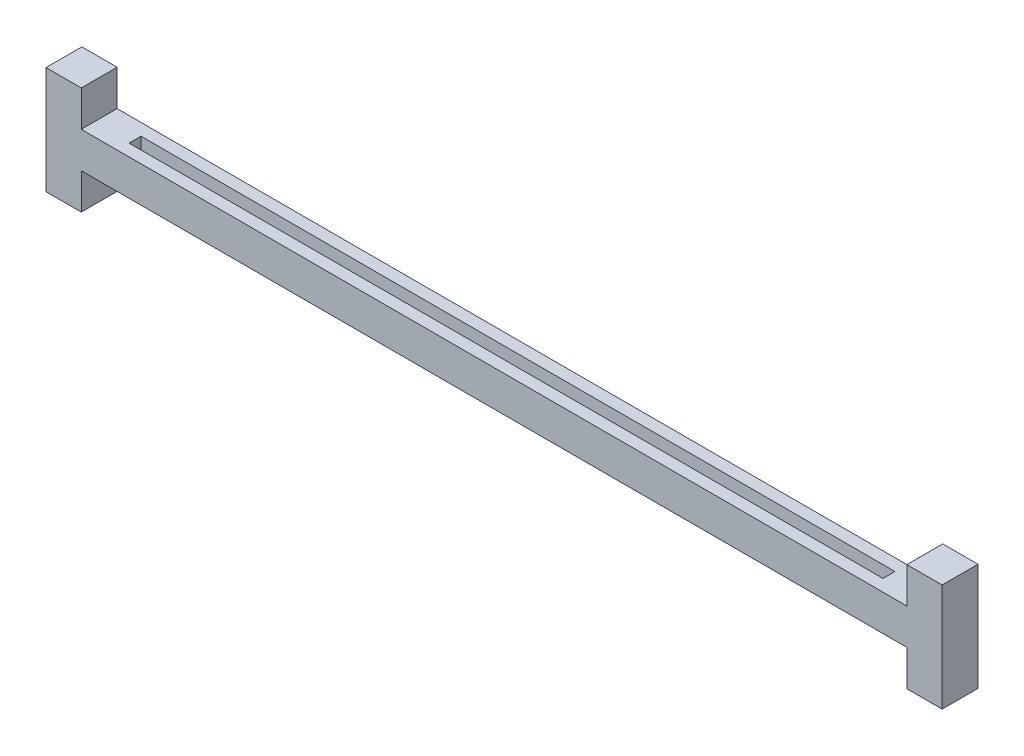
ISO-10303-21;
HEADER;
FILE_DESCRIPTION(('STEP AP214'),'2;1');
FILE_NAME('part.step','',(''),(''),'','','');
FILE_SCHEMA(('AUTOMOTIVE_DESIGN { 1 0 10303 214 1 1 1 1 }'));
ENDSEC;
DATA;
#1=APPLICATION_CONTEXT('core data for automotive mechanical design processes');
#2=APPLICATION_PROTOCOL_DEFINITION('international standard','automotive_design',2000,#1);
#3=PRODUCT_CONTEXT('',#1,'mechanical');
#4=PRODUCT('Part','Part','',(#3));
#5=PRODUCT_RELATED_PRODUCT_CATEGORY('part','',(#4));
#6=PRODUCT_DEFINITION_FORMATION('','',#4);
#7=PRODUCT_DEFINITION_CONTEXT('part definition',#1,'design');
#8=PRODUCT_DEFINITION('design','',#6,#7);
#9=PRODUCT_DEFINITION_SHAPE('','',#8);
#10=(LENGTH_UNIT() NAMED_UNIT(*) SI_UNIT(.MILLI.,.METRE.));
#11=(NAMED_UNIT(*) PLANE_ANGLE_UNIT() SI_UNIT($,.RADIAN.));
#12=(NAMED_UNIT(*) SI_UNIT($,.STERADIAN.) SOLID_ANGLE_UNIT());
#13=UNCERTAINTY_MEASURE_WITH_UNIT(LENGTH_MEASURE(1.E-05),#10,'distance_accuracy_value','');
#14=(GEOMETRIC_REPRESENTATION_CONTEXT(3) GLOBAL_UNCERTAINTY_ASSIGNED_CONTEXT((#13)) GLOBAL_UNIT_ASSIGNED_CONTEXT((#10,
#11,#12)) REPRESENTATION_CONTEXT('',''));
#15=CARTESIAN_POINT('',(0.,0.,0.));
#16=DIRECTION('',(0.,0.,1.));
#17=DIRECTION('',(1.,0.,0.));
#18=AXIS2_PLACEMENT_3D('',#15,#16,#17);
#19=CARTESIAN_POINT('',(-57.58,-2.5,5.));
#20=DIRECTION('',(0.,1.,0.));
#21=DIRECTION('',(0.,0.,1.));
#22=AXIS2_PLACEMENT_3D('',#19,#20,#21);
#23=PLANE('',#22);
#24=DIRECTION('',(1.,0.,0.));
#25=VECTOR('',#24,1.);
#26=CARTESIAN_POINT('',(-57.58,-2.5,0.));
#27=LINE('',#26,#25);
#28=CARTESIAN_POINT('',(-57.58,-2.5,0.));
#29=VERTEX_POINT('',#28);
#30=CARTESIAN_POINT('',(57.58,-2.5,0.));
#31=VERTEX_POINT('',#30);
#32=EDGE_CURVE('E214',#29,#31,#27,.T.);
#33=ORIENTED_EDGE('',*,*,#32,.T.);
#34=DIRECTION('',(0.,0.,-1.));
#35=VECTOR('',#34,1.);
#36=CARTESIAN_POINT('',(57.58,-2.5,5.));
#37=LINE('',#36,#35);
#38=CARTESIAN_POINT('',(57.58,-2.5,5.));
#39=VERTEX_POINT('',#38);
#40=EDGE_CURVE('E254',#39,#31,#37,.T.);
#41=ORIENTED_EDGE('',*,*,#40,.F.);
#42=DIRECTION('',(1.,0.,0.));
#43=VECTOR('',#42,1.);
#44=CARTESIAN_POINT('',(-57.58,-2.5,5.));
#45=LINE('',#44,#43);
#46=CARTESIAN_POINT('',(-57.58,-2.5,5.));
#47=VERTEX_POINT('',#46);
#48=EDGE_CURVE('E189',#47,#39,#45,.T.);
#49=ORIENTED_EDGE('',*,*,#48,.F.);
#50=DIRECTION('',(0.,0.,-1.));
#51=VECTOR('',#50,1.);
#52=CARTESIAN_POINT('',(-57.58,-2.5,5.));
#53=LINE('',#52,#51);
#54=EDGE_CURVE('E257',#47,#29,#53,.T.);
#55=ORIENTED_EDGE('',*,*,#54,.T.);
#56=EDGE_LOOP('',(#33,#41,#49,#55));
#57=FACE_BOUND('',#56,.T.);
#58=DIRECTION('',(1.,0.,0.));
#59=VECTOR('',#58,1.);
#60=CARTESIAN_POINT('',(0.,-2.5,3.33333333333333));
#61=LINE('',#60,#59);
#62=CARTESIAN_POINT('',(-52.58,-2.5,3.33333333333333));
#63=VERTEX_POINT('',#62);
#64=CARTESIAN_POINT('',(52.58,-2.5,3.33333333333333));
#65=VERTEX_POINT('',#64);
#66=EDGE_CURVE('E57',#63,#65,#61,.T.);
#67=ORIENTED_EDGE('',*,*,#66,.T.);
#68=DIRECTION('',(0.,0.,-1.));
#69=VECTOR('',#68,1.);
#70=CARTESIAN_POINT('',(52.58,-2.5,0.));
#71=LINE('',#70,#69);
#72=CARTESIAN_POINT('',(52.58,-2.5,1.66666666666667));
#73=VERTEX_POINT('',#72);
#74=EDGE_CURVE('E171',#65,#73,#71,.T.);
#75=ORIENTED_EDGE('',*,*,#74,.T.);
#76=DIRECTION('',(1.,0.,0.));
#77=VECTOR('',#76,1.);
#78=CARTESIAN_POINT('',(0.,-2.5,1.66666666666667));
#79=LINE('',#78,#77);
#80=CARTESIAN_POINT('',(-52.58,-2.5,1.66666666666667));
#81=VERTEX_POINT('',#80);
#82=EDGE_CURVE('E157',#81,#73,#79,.T.);
#83=ORIENTED_EDGE('',*,*,#82,.F.);
#84=DIRECTION('',(0.,0.,-1.));
#85=VECTOR('',#84,1.);
#86=CARTESIAN_POINT('',(-52.58,-2.5,0.));
#87=LINE('',#86,#85);
#88=EDGE_CURVE('E166',#63,#81,#87,.T.);
#89=ORIENTED_EDGE('',*,*,#88,.F.);
#90=EDGE_LOOP('',(#67,#75,#83,#89));
#91=FACE_BOUND('',#90,.T.);
#92=ADVANCED_FACE('F42',(#57,#91),#23,.F.);
#93=CARTESIAN_POINT('',(-57.58,2.5,5.));
#94=DIRECTION('',(0.,-1.,0.));
#95=DIRECTION('',(0.,0.,-1.));
#96=AXIS2_PLACEMENT_3D('',#93,#94,#95);
#97=PLANE('',#96);
#98=DIRECTION('',(-1.,0.,0.));
#99=VECTOR('',#98,1.);
#100=CARTESIAN_POINT('',(-57.58,2.5,0.));
#101=LINE('',#100,#99);
#102=CARTESIAN_POINT('',(57.58,2.5,0.));
#103=VERTEX_POINT('',#102);
#104=CARTESIAN_POINT('',(-57.58,2.5,0.));
#105=VERTEX_POINT('',#104);
#106=EDGE_CURVE('E226',#103,#105,#101,.T.);
#107=ORIENTED_EDGE('',*,*,#106,.T.);
#108=DIRECTION('',(0.,0.,-1.));
#109=VECTOR('',#108,1.);
#110=CARTESIAN_POINT('',(-57.58,2.5,5.));
#111=LINE('',#110,#109);
#112=CARTESIAN_POINT('',(-57.58,2.5,5.));
#113=VERTEX_POINT('',#112);
#114=EDGE_CURVE('E236',#113,#105,#111,.T.);
#115=ORIENTED_EDGE('',*,*,#114,.F.);
#116=DIRECTION('',(-1.,0.,0.));
#117=VECTOR('',#116,1.);
#118=CARTESIAN_POINT('',(-57.58,2.5,5.));
#119=LINE('',#118,#117);
#120=CARTESIAN_POINT('',(57.58,2.5,5.));
#121=VERTEX_POINT('',#120);
#122=EDGE_CURVE('E201',#121,#113,#119,.T.);
#123=ORIENTED_EDGE('',*,*,#122,.F.);
#124=DIRECTION('',(0.,0.,-1.));
#125=VECTOR('',#124,1.);
#126=CARTESIAN_POINT('',(57.58,2.5,5.));
#127=LINE('',#126,#125);
#128=EDGE_CURVE('E239',#121,#103,#127,.T.);
#129=ORIENTED_EDGE('',*,*,#128,.T.);
#130=EDGE_LOOP('',(#107,#115,#123,#129));
#131=FACE_BOUND('',#130,.T.);
#132=DIRECTION('',(1.,0.,0.));
#133=VECTOR('',#132,1.);
#134=CARTESIAN_POINT('',(-57.58,2.5,3.33333333333333));
#135=LINE('',#134,#133);
#136=CARTESIAN_POINT('',(-52.58,2.5,3.33333333333333));
#137=VERTEX_POINT('',#136);
#138=CARTESIAN_POINT('',(52.58,2.5,3.33333333333333));
#139=VERTEX_POINT('',#138);
#140=EDGE_CURVE('E11',#137,#139,#135,.T.);
#141=ORIENTED_EDGE('',*,*,#140,.F.);
#142=DIRECTION('',(0.,0.,-1.));
#143=VECTOR('',#142,1.);
#144=CARTESIAN_POINT('',(-52.58,2.5,5.));
#145=LINE('',#144,#143);
#146=CARTESIAN_POINT('',(-52.58,2.5,1.66666666666667));
#147=VERTEX_POINT('',#146);
#148=EDGE_CURVE('E266',#137,#147,#145,.T.);
#149=ORIENTED_EDGE('',*,*,#148,.T.);
#150=DIRECTION('',(1.,0.,0.));
#151=VECTOR('',#150,1.);
#152=CARTESIAN_POINT('',(-57.58,2.5,1.66666666666667));
#153=LINE('',#152,#151);
#154=CARTESIAN_POINT('',(52.58,2.5,1.66666666666667));
#155=VERTEX_POINT('',#154);
#156=EDGE_CURVE('E160',#147,#155,#153,.T.);
#157=ORIENTED_EDGE('',*,*,#156,.T.);
#158=DIRECTION('',(0.,0.,-1.));
#159=VECTOR('',#158,1.);
#160=CARTESIAN_POINT('',(52.58,2.5,5.));
#161=LINE('',#160,#159);
#162=EDGE_CURVE('E50',#139,#155,#161,.T.);
#163=ORIENTED_EDGE('',*,*,#162,.F.);
#164=EDGE_LOOP('',(#141,#149,#157,#163));
#165=FACE_BOUND('',#164,.T.);
#166=ADVANCED_FACE('F274',(#131,#165),#97,.F.);
#167=CARTESIAN_POINT('',(-62.5,7.5,5.));
#168=DIRECTION('',(1.,0.,0.));
#169=DIRECTION('',(0.,0.,-1.));
#170=AXIS2_PLACEMENT_3D('',#167,#168,#169);
#171=PLANE('',#170);
#172=DIRECTION('',(0.,-1.,0.));
#173=VECTOR('',#172,1.);
#174=CARTESIAN_POINT('',(-62.5,7.5,0.));
#175=LINE('',#174,#173);
#176=CARTESIAN_POINT('',(-62.5,7.5,0.));
#177=VERTEX_POINT('',#176);
#178=CARTESIAN_POINT('',(-62.5,-7.5,0.));
#179=VERTEX_POINT('',#178);
#180=EDGE_CURVE('E178',#177,#179,#175,.T.);
#181=ORIENTED_EDGE('',*,*,#180,.T.);
#182=DIRECTION('',(0.,0.,-1.));
#183=VECTOR('',#182,1.);
#184=CARTESIAN_POINT('',(-62.5,-7.5,5.));
#185=LINE('',#184,#183);
#186=CARTESIAN_POINT('',(-62.5,-7.5,5.));
#187=VERTEX_POINT('',#186);
#188=EDGE_CURVE('E263',#187,#179,#185,.T.);
#189=ORIENTED_EDGE('',*,*,#188,.F.);
#190=DIRECTION('',(0.,-1.,0.));
#191=VECTOR('',#190,1.);
#192=CARTESIAN_POINT('',(-62.5,7.5,5.));
#193=LINE('',#192,#191);
#194=CARTESIAN_POINT('',(-62.5,7.5,5.));
#195=VERTEX_POINT('',#194);
#196=EDGE_CURVE('E181',#195,#187,#193,.T.);
#197=ORIENTED_EDGE('',*,*,#196,.F.);
#198=DIRECTION('',(0.,0.,-1.));
#199=VECTOR('',#198,1.);
#200=CARTESIAN_POINT('',(-62.5,7.5,5.));
#201=LINE('',#200,#199);
#202=EDGE_CURVE('E207',#195,#177,#201,.T.);
#203=ORIENTED_EDGE('',*,*,#202,.T.);
#204=EDGE_LOOP('',(#181,#189,#197,#203));
#205=FACE_BOUND('',#204,.T.);
#206=ADVANCED_FACE('F44',(#205),#171,.F.);
#207=CARTESIAN_POINT('',(-62.5,-7.5,5.));
#208=DIRECTION('',(0.,1.,0.));
#209=DIRECTION('',(0.,0.,1.));
#210=AXIS2_PLACEMENT_3D('',#207,#208,#209);
#211=PLANE('',#210);
#212=DIRECTION('',(1.,0.,0.));
#213=VECTOR('',#212,1.);
#214=CARTESIAN_POINT('',(-62.5,-7.5,0.));
#215=LINE('',#214,#213);
#216=CARTESIAN_POINT('',(-57.58,-7.5,0.));
#217=VERTEX_POINT('',#216);
#218=EDGE_CURVE('E210',#179,#217,#215,.T.);
#219=ORIENTED_EDGE('',*,*,#218,.T.);
#220=DIRECTION('',(0.,0.,-1.));
#221=VECTOR('',#220,1.);
#222=CARTESIAN_POINT('',(-57.58,-7.5,5.));
#223=LINE('',#222,#221);
#224=CARTESIAN_POINT('',(-57.58,-7.5,5.));
#225=VERTEX_POINT('',#224);
#226=EDGE_CURVE('E260',#225,#217,#223,.T.);
#227=ORIENTED_EDGE('',*,*,#226,.F.);
#228=DIRECTION('',(1.,0.,0.));
#229=VECTOR('',#228,1.);
#230=CARTESIAN_POINT('',(-62.5,-7.5,5.));
#231=LINE('',#230,#229);
#232=EDGE_CURVE('E184',#187,#225,#231,.T.);
#233=ORIENTED_EDGE('',*,*,#232,.F.);
#234=ORIENTED_EDGE('',*,*,#188,.T.);
#235=EDGE_LOOP('',(#219,#227,#233,#234));
#236=FACE_BOUND('',#235,.T.);
#237=ADVANCED_FACE('F303',(#236),#211,.F.);
#238=CARTESIAN_POINT('',(-57.58,-2.5,5.));
#239=DIRECTION('',(-1.,0.,0.));
#240=DIRECTION('',(0.,0.,1.));
#241=AXIS2_PLACEMENT_3D('',#238,#239,#240);
#242=PLANE('',#241);
#243=DIRECTION('',(0.,1.,0.));
#244=VECTOR('',#243,1.);
#245=CARTESIAN_POINT('',(-57.58,-2.5,0.));
#246=LINE('',#245,#244);
#247=EDGE_CURVE('E212',#217,#29,#246,.T.);
#248=ORIENTED_EDGE('',*,*,#247,.T.);
#249=ORIENTED_EDGE('',*,*,#54,.F.);
#250=DIRECTION('',(0.,1.,0.));
#251=VECTOR('',#250,1.);
#252=CARTESIAN_POINT('',(-57.58,-2.5,5.));
#253=LINE('',#252,#251);
#254=EDGE_CURVE('E187',#225,#47,#253,.T.);
#255=ORIENTED_EDGE('',*,*,#254,.F.);
#256=ORIENTED_EDGE('',*,*,#226,.T.);
#257=EDGE_LOOP('',(#248,#249,#255,#256));
#258=FACE_BOUND('',#257,.T.);
#259=ADVANCED_FACE('F301',(#258),#242,.F.);
#260=CARTESIAN_POINT('',(57.58,-2.5,5.));
#261=DIRECTION('',(1.,0.,0.));
#262=DIRECTION('',(0.,0.,-1.));
#263=AXIS2_PLACEMENT_3D('',#260,#261,#262);
#264=PLANE('',#263);
#265=DIRECTION('',(0.,-1.,0.));
#266=VECTOR('',#265,1.);
#267=CARTESIAN_POINT('',(57.58,-2.5,0.));
#268=LINE('',#267,#266);
#269=CARTESIAN_POINT('',(57.58,-7.5,0.));
#270=VERTEX_POINT('',#269);
#271=EDGE_CURVE('E216',#31,#270,#268,.T.);
#272=ORIENTED_EDGE('',*,*,#271,.T.);
#273=DIRECTION('',(0.,0.,-1.));
#274=VECTOR('',#273,1.);
#275=CARTESIAN_POINT('',(57.58,-7.5,5.));
#276=LINE('',#275,#274);
#277=CARTESIAN_POINT('',(57.58,-7.5,5.));
#278=VERTEX_POINT('',#277);
#279=EDGE_CURVE('E251',#278,#270,#276,.T.);
#280=ORIENTED_EDGE('',*,*,#279,.F.);
#281=DIRECTION('',(0.,-1.,0.));
#282=VECTOR('',#281,1.);
#283=CARTESIAN_POINT('',(57.58,-2.5,5.));
#284=LINE('',#283,#282);
#285=EDGE_CURVE('E191',#39,#278,#284,.T.);
#286=ORIENTED_EDGE('',*,*,#285,.F.);
#287=ORIENTED_EDGE('',*,*,#40,.T.);
#288=EDGE_LOOP('',(#272,#280,#286,#287));
#289=FACE_BOUND('',#288,.T.);
#290=ADVANCED_FACE('F299',(#289),#264,.F.);
#291=CARTESIAN_POINT('',(57.58,-7.5,5.));
#292=DIRECTION('',(0.,1.,0.));
#293=DIRECTION('',(0.,0.,1.));
#294=AXIS2_PLACEMENT_3D('',#291,#292,#293);
#295=PLANE('',#294);
#296=DIRECTION('',(1.,0.,0.));
#297=VECTOR('',#296,1.);
#298=CARTESIAN_POINT('',(57.58,-7.5,0.));
#299=LINE('',#298,#297);
#300=CARTESIAN_POINT('',(62.5,-7.5,0.));
#301=VERTEX_POINT('',#300);
#302=EDGE_CURVE('E218',#270,#301,#299,.T.);
#303=ORIENTED_EDGE('',*,*,#302,.T.);
#304=DIRECTION('',(0.,0.,-1.));
#305=VECTOR('',#304,1.);
#306=CARTESIAN_POINT('',(62.5,-7.5,5.));
#307=LINE('',#306,#305);
#308=CARTESIAN_POINT('',(62.5,-7.5,5.));
#309=VERTEX_POINT('',#308);
#310=EDGE_CURVE('E248',#309,#301,#307,.T.);
#311=ORIENTED_EDGE('',*,*,#310,.F.);
#312=DIRECTION('',(1.,0.,0.));
#313=VECTOR('',#312,1.);
#314=CARTESIAN_POINT('',(57.58,-7.5,5.));
#315=LINE('',#314,#313);
#316=EDGE_CURVE('E193',#278,#309,#315,.T.);
#317=ORIENTED_EDGE('',*,*,#316,.F.);
#318=ORIENTED_EDGE('',*,*,#279,.T.);
#319=EDGE_LOOP('',(#303,#311,#317,#318));
#320=FACE_BOUND('',#319,.T.);
#321=ADVANCED_FACE('F358',(#320),#295,.F.);
#322=CARTESIAN_POINT('',(62.5,7.5,5.));
#323=DIRECTION('',(-1.,0.,0.));
#324=DIRECTION('',(0.,0.,1.));
#325=AXIS2_PLACEMENT_3D('',#322,#323,#324);
#326=PLANE('',#325);
#327=DIRECTION('',(0.,1.,0.));
#328=VECTOR('',#327,1.);
#329=CARTESIAN_POINT('',(62.5,7.5,0.));
#330=LINE('',#329,#328);
#331=CARTESIAN_POINT('',(62.5,7.5,0.));
#332=VERTEX_POINT('',#331);
#333=EDGE_CURVE('E220',#301,#332,#330,.T.);
#334=ORIENTED_EDGE('',*,*,#333,.T.);
#335=DIRECTION('',(0.,0.,-1.));
#336=VECTOR('',#335,1.);
#337=CARTESIAN_POINT('',(62.5,7.5,5.));
#338=LINE('',#337,#336);
#339=CARTESIAN_POINT('',(62.5,7.5,5.));
#340=VERTEX_POINT('',#339);
#341=EDGE_CURVE('E245',#340,#332,#338,.T.);
#342=ORIENTED_EDGE('',*,*,#341,.F.);
#343=DIRECTION('',(0.,1.,0.));
#344=VECTOR('',#343,1.);
#345=CARTESIAN_POINT('',(62.5,7.5,5.));
#346=LINE('',#345,#344);
#347=EDGE_CURVE('E195',#309,#340,#346,.T.);
#348=ORIENTED_EDGE('',*,*,#347,.F.);
#349=ORIENTED_EDGE('',*,*,#310,.T.);
#350=EDGE_LOOP('',(#334,#342,#348,#349));
#351=FACE_BOUND('',#350,.T.);
#352=ADVANCED_FACE('F356',(#351),#326,.F.);
#353=CARTESIAN_POINT('',(57.58,7.50000000000001,5.));
#354=DIRECTION('',(0.,-1.,0.));
#355=DIRECTION('',(1.,0.,0.));
#356=AXIS2_PLACEMENT_3D('',#353,#354,#355);
#357=PLANE('',#356);
#358=DIRECTION('',(-1.,0.,0.));
#359=VECTOR('',#358,1.);
#360=CARTESIAN_POINT('',(57.58,7.50000000000001,0.));
#361=LINE('',#360,#359);
#362=CARTESIAN_POINT('',(57.58,7.50000000000001,0.));
#363=VERTEX_POINT('',#362);
#364=EDGE_CURVE('E222',#332,#363,#361,.T.);
#365=ORIENTED_EDGE('',*,*,#364,.T.);
#366=DIRECTION('',(0.,0.,-1.));
#367=VECTOR('',#366,1.);
#368=CARTESIAN_POINT('',(57.58,7.50000000000001,5.));
#369=LINE('',#368,#367);
#370=CARTESIAN_POINT('',(57.58,7.50000000000001,5.));
#371=VERTEX_POINT('',#370);
#372=EDGE_CURVE('E242',#371,#363,#369,.T.);
#373=ORIENTED_EDGE('',*,*,#372,.F.);
#374=DIRECTION('',(-1.,0.,0.));
#375=VECTOR('',#374,1.);
#376=CARTESIAN_POINT('',(57.58,7.50000000000001,5.));
#377=LINE('',#376,#375);
#378=EDGE_CURVE('E197',#340,#371,#377,.T.);
#379=ORIENTED_EDGE('',*,*,#378,.F.);
#380=ORIENTED_EDGE('',*,*,#341,.T.);
#381=EDGE_LOOP('',(#365,#373,#379,#380));
#382=FACE_BOUND('',#381,.T.);
#383=ADVANCED_FACE('F352',(#382),#357,.F.);
#384=CARTESIAN_POINT('',(57.58,7.50000000000001,5.));
#385=DIRECTION('',(1.,0.,0.));
#386=DIRECTION('',(0.,1.,0.));
#387=AXIS2_PLACEMENT_3D('',#384,#385,#386);
#388=PLANE('',#387);
#389=DIRECTION('',(0.,-1.,0.));
#390=VECTOR('',#389,1.);
#391=CARTESIAN_POINT('',(57.58,7.50000000000001,0.));
#392=LINE('',#391,#390);
#393=EDGE_CURVE('E224',#363,#103,#392,.T.);
#394=ORIENTED_EDGE('',*,*,#393,.T.);
#395=ORIENTED_EDGE('',*,*,#128,.F.);
#396=DIRECTION('',(0.,-1.,0.));
#397=VECTOR('',#396,1.);
#398=CARTESIAN_POINT('',(57.58,7.50000000000001,5.));
#399=LINE('',#398,#397);
#400=EDGE_CURVE('E199',#371,#121,#399,.T.);
#401=ORIENTED_EDGE('',*,*,#400,.F.);
#402=ORIENTED_EDGE('',*,*,#372,.T.);
#403=EDGE_LOOP('',(#394,#395,#401,#402));
#404=FACE_BOUND('',#403,.T.);
#405=ADVANCED_FACE('F347',(#404),#388,.F.);
#406=CARTESIAN_POINT('',(-57.58,7.50000000000001,5.));
#407=DIRECTION('',(-1.,0.,0.));
#408=DIRECTION('',(0.,0.,1.));
#409=AXIS2_PLACEMENT_3D('',#406,#407,#408);
#410=PLANE('',#409);
#411=DIRECTION('',(0.,1.,0.));
#412=VECTOR('',#411,1.);
#413=CARTESIAN_POINT('',(-57.58,7.50000000000001,0.));
#414=LINE('',#413,#412);
#415=CARTESIAN_POINT('',(-57.58,7.50000000000001,0.));
#416=VERTEX_POINT('',#415);
#417=EDGE_CURVE('E228',#105,#416,#414,.T.);
#418=ORIENTED_EDGE('',*,*,#417,.T.);
#419=DIRECTION('',(0.,0.,-1.));
#420=VECTOR('',#419,1.);
#421=CARTESIAN_POINT('',(-57.58,7.50000000000001,5.));
#422=LINE('',#421,#420);
#423=CARTESIAN_POINT('',(-57.58,7.50000000000001,5.));
#424=VERTEX_POINT('',#423);
#425=EDGE_CURVE('E233',#424,#416,#422,.T.);
#426=ORIENTED_EDGE('',*,*,#425,.F.);
#427=DIRECTION('',(0.,1.,0.));
#428=VECTOR('',#427,1.);
#429=CARTESIAN_POINT('',(-57.58,7.50000000000001,5.));
#430=LINE('',#429,#428);
#431=EDGE_CURVE('E203',#113,#424,#430,.T.);
#432=ORIENTED_EDGE('',*,*,#431,.F.);
#433=ORIENTED_EDGE('',*,*,#114,.T.);
#434=EDGE_LOOP('',(#418,#426,#432,#433));
#435=FACE_BOUND('',#434,.T.);
#436=ADVANCED_FACE('F339',(#435),#410,.F.);
#437=CARTESIAN_POINT('',(-62.5,7.5,5.));
#438=DIRECTION('',(0.,-1.,0.));
#439=DIRECTION('',(1.,0.,0.));
#440=AXIS2_PLACEMENT_3D('',#437,#438,#439);
#441=PLANE('',#440);
#442=DIRECTION('',(-1.,0.,0.));
#443=VECTOR('',#442,1.);
#444=CARTESIAN_POINT('',(-62.5,7.5,0.));
#445=LINE('',#444,#443);
#446=EDGE_CURVE('E185',#416,#177,#445,.T.);
#447=ORIENTED_EDGE('',*,*,#446,.T.);
#448=ORIENTED_EDGE('',*,*,#202,.F.);
#449=DIRECTION('',(-1.,0.,0.));
#450=VECTOR('',#449,1.);
#451=CARTESIAN_POINT('',(-62.5,7.5,5.));
#452=LINE('',#451,#450);
#453=EDGE_CURVE('E205',#424,#195,#452,.T.);
#454=ORIENTED_EDGE('',*,*,#453,.F.);
#455=ORIENTED_EDGE('',*,*,#425,.T.);
#456=EDGE_LOOP('',(#447,#448,#454,#455));
#457=FACE_BOUND('',#456,.T.);
#458=ADVANCED_FACE('F335',(#457),#441,.F.);
#459=CARTESIAN_POINT('',(0.,0.,5.));
#460=DIRECTION('',(0.,0.,1.));
#461=DIRECTION('',(1.,0.,0.));
#462=AXIS2_PLACEMENT_3D('',#459,#460,#461);
#463=PLANE('',#462);
#464=ORIENTED_EDGE('',*,*,#196,.T.);
#465=ORIENTED_EDGE('',*,*,#232,.T.);
#466=ORIENTED_EDGE('',*,*,#254,.T.);
#467=ORIENTED_EDGE('',*,*,#48,.T.);
#468=ORIENTED_EDGE('',*,*,#285,.T.);
#469=ORIENTED_EDGE('',*,*,#316,.T.);
#470=ORIENTED_EDGE('',*,*,#347,.T.);
#471=ORIENTED_EDGE('',*,*,#378,.T.);
#472=ORIENTED_EDGE('',*,*,#400,.T.);
#473=ORIENTED_EDGE('',*,*,#122,.T.);
#474=ORIENTED_EDGE('',*,*,#431,.T.);
#475=ORIENTED_EDGE('',*,*,#453,.T.);
#476=EDGE_LOOP('',(#464,#465,#466,#467,#468,#469,#470,#471,#472,#473,#474,#475));
#477=FACE_BOUND('',#476,.T.);
#478=ADVANCED_FACE('F285',(#477),#463,.T.);
#479=CARTESIAN_POINT('',(0.,0.,0.));
#480=DIRECTION('',(0.,0.,1.));
#481=DIRECTION('',(1.,0.,0.));
#482=AXIS2_PLACEMENT_3D('',#479,#480,#481);
#483=PLANE('',#482);
#484=ORIENTED_EDGE('',*,*,#180,.F.);
#485=ORIENTED_EDGE('',*,*,#446,.F.);
#486=ORIENTED_EDGE('',*,*,#417,.F.);
#487=ORIENTED_EDGE('',*,*,#106,.F.);
#488=ORIENTED_EDGE('',*,*,#393,.F.);
#489=ORIENTED_EDGE('',*,*,#364,.F.);
#490=ORIENTED_EDGE('',*,*,#333,.F.);
#491=ORIENTED_EDGE('',*,*,#302,.F.);
#492=ORIENTED_EDGE('',*,*,#271,.F.);
#493=ORIENTED_EDGE('',*,*,#32,.F.);
#494=ORIENTED_EDGE('',*,*,#247,.F.);
#495=ORIENTED_EDGE('',*,*,#218,.F.);
#496=EDGE_LOOP('',(#484,#485,#486,#487,#488,#489,#490,#491,#492,#493,#494,#495));
#497=FACE_BOUND('',#496,.T.);
#498=ADVANCED_FACE('F277',(#497),#483,.F.);
#499=CARTESIAN_POINT('',(0.,7.50000000000001,3.33333333333333));
#500=DIRECTION('',(0.,0.,-1.));
#501=DIRECTION('',(-1.,0.,0.));
#502=AXIS2_PLACEMENT_3D('',#499,#500,#501);
#503=PLANE('',#502);
#504=ORIENTED_EDGE('',*,*,#140,.T.);
#505=DIRECTION('',(0.,-1.,0.));
#506=VECTOR('',#505,1.);
#507=CARTESIAN_POINT('',(52.58,7.50000000000001,3.33333333333333));
#508=LINE('',#507,#506);
#509=EDGE_CURVE('E176',#139,#65,#508,.T.);
#510=ORIENTED_EDGE('',*,*,#509,.T.);
#511=ORIENTED_EDGE('',*,*,#66,.F.);
#512=DIRECTION('',(0.,-1.,0.));
#513=VECTOR('',#512,1.);
#514=CARTESIAN_POINT('',(-52.58,7.50000000000001,3.33333333333333));
#515=LINE('',#514,#513);
#516=EDGE_CURVE('E163',#137,#63,#515,.T.);
#517=ORIENTED_EDGE('',*,*,#516,.F.);
#518=EDGE_LOOP('',(#504,#510,#511,#517));
#519=FACE_BOUND('',#518,.T.);
#520=ADVANCED_FACE('F275',(#519),#503,.T.);
#521=CARTESIAN_POINT('',(52.58,7.50000000000001,0.));
#522=DIRECTION('',(-1.,0.,0.));
#523=DIRECTION('',(0.,0.,1.));
#524=AXIS2_PLACEMENT_3D('',#521,#522,#523);
#525=PLANE('',#524);
#526=ORIENTED_EDGE('',*,*,#162,.T.);
#527=DIRECTION('',(0.,-1.,0.));
#528=VECTOR('',#527,1.);
#529=CARTESIAN_POINT('',(52.58,7.50000000000001,1.66666666666667));
#530=LINE('',#529,#528);
#531=EDGE_CURVE('E162',#155,#73,#530,.T.);
#532=ORIENTED_EDGE('',*,*,#531,.T.);
#533=ORIENTED_EDGE('',*,*,#74,.F.);
#534=ORIENTED_EDGE('',*,*,#509,.F.);
#535=EDGE_LOOP('',(#526,#532,#533,#534));
#536=FACE_BOUND('',#535,.T.);
#537=ADVANCED_FACE('F271',(#536),#525,.T.);
#538=CARTESIAN_POINT('',(0.,7.50000000000001,1.66666666666667));
#539=DIRECTION('',(0.,0.,-1.));
#540=DIRECTION('',(-1.,0.,0.));
#541=AXIS2_PLACEMENT_3D('',#538,#539,#540);
#542=PLANE('',#541);
#543=DIRECTION('',(0.,-1.,0.));
#544=VECTOR('',#543,1.);
#545=CARTESIAN_POINT('',(-52.58,7.50000000000001,1.66666666666667));
#546=LINE('',#545,#544);
#547=EDGE_CURVE('E65',#147,#81,#546,.T.);
#548=ORIENTED_EDGE('',*,*,#547,.T.);
#549=ORIENTED_EDGE('',*,*,#82,.T.);
#550=ORIENTED_EDGE('',*,*,#531,.F.);
#551=ORIENTED_EDGE('',*,*,#156,.F.);
#552=EDGE_LOOP('',(#548,#549,#550,#551));
#553=FACE_BOUND('',#552,.T.);
#554=ADVANCED_FACE('F154',(#553),#542,.F.);
#555=CARTESIAN_POINT('',(-52.58,7.50000000000001,0.));
#556=DIRECTION('',(-1.,0.,0.));
#557=DIRECTION('',(0.,0.,1.));
#558=AXIS2_PLACEMENT_3D('',#555,#556,#557);
#559=PLANE('',#558);
#560=ORIENTED_EDGE('',*,*,#516,.T.);
#561=ORIENTED_EDGE('',*,*,#88,.T.);
#562=ORIENTED_EDGE('',*,*,#547,.F.);
#563=ORIENTED_EDGE('',*,*,#148,.F.);
#564=EDGE_LOOP('',(#560,#561,#562,#563));
#565=FACE_BOUND('',#564,.T.);
#566=ADVANCED_FACE('F167',(#565),#559,.F.);
#567=CLOSED_SHELL('',(#92,#166,#206,#237,#259,#290,#321,#352,#383,#405,#436,#458,#478,#498,#520,
#537,#554,#566));
#568=MANIFOLD_SOLID_BREP('B2',#567);
#569=ADVANCED_BREP_SHAPE_REPRESENTATION('',(#18,#568),#14);
#570=SHAPE_DEFINITION_REPRESENTATION(#9,#569);
ENDSEC;
END-ISO-10303-21;
